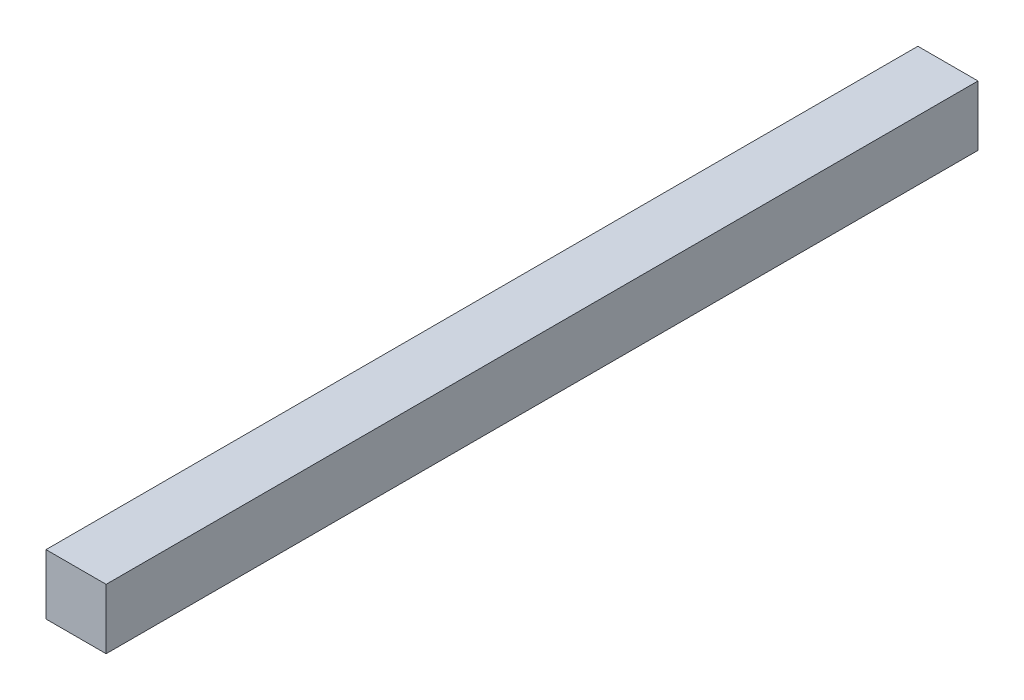
ISO-10303-21;
HEADER;
FILE_DESCRIPTION(('STEP AP214'),'2;1');
FILE_NAME('part.step','',(''),(''),'','','');
FILE_SCHEMA(('AUTOMOTIVE_DESIGN { 1 0 10303 214 1 1 1 1 }'));
ENDSEC;
DATA;
#1=APPLICATION_CONTEXT('core data for automotive mechanical design processes');
#2=APPLICATION_PROTOCOL_DEFINITION('international standard','automotive_design',2000,#1);
#3=PRODUCT_CONTEXT('',#1,'mechanical');
#4=PRODUCT('Part','Part','',(#3));
#5=PRODUCT_RELATED_PRODUCT_CATEGORY('part','',(#4));
#6=PRODUCT_DEFINITION_FORMATION('','',#4);
#7=PRODUCT_DEFINITION_CONTEXT('part definition',#1,'design');
#8=PRODUCT_DEFINITION('design','',#6,#7);
#9=PRODUCT_DEFINITION_SHAPE('','',#8);
#10=(LENGTH_UNIT() NAMED_UNIT(*) SI_UNIT(.MILLI.,.METRE.));
#11=(NAMED_UNIT(*) PLANE_ANGLE_UNIT() SI_UNIT($,.RADIAN.));
#12=(NAMED_UNIT(*) SI_UNIT($,.STERADIAN.) SOLID_ANGLE_UNIT());
#13=UNCERTAINTY_MEASURE_WITH_UNIT(LENGTH_MEASURE(1.E-05),#10,'distance_accuracy_value','');
#14=(GEOMETRIC_REPRESENTATION_CONTEXT(3) GLOBAL_UNCERTAINTY_ASSIGNED_CONTEXT((#13)) GLOBAL_UNIT_ASSIGNED_CONTEXT((#10,
#11,#12)) REPRESENTATION_CONTEXT('',''));
#15=CARTESIAN_POINT('',(0.,0.,0.));
#16=DIRECTION('',(0.,0.,1.));
#17=DIRECTION('',(1.,0.,0.));
#18=AXIS2_PLACEMENT_3D('',#15,#16,#17);
#19=CARTESIAN_POINT('',(-3.,6.,43.5));
#20=DIRECTION('',(1.,0.,0.));
#21=DIRECTION('',(0.,0.,-1.));
#22=AXIS2_PLACEMENT_3D('',#19,#20,#21);
#23=PLANE('',#22);
#24=DIRECTION('',(0.,0.,1.));
#25=VECTOR('',#24,1.);
#26=CARTESIAN_POINT('',(-3.,0.,43.5));
#27=LINE('',#26,#25);
#28=CARTESIAN_POINT('',(-3.,0.,-43.5));
#29=VERTEX_POINT('',#28);
#30=CARTESIAN_POINT('',(-3.,0.,43.5));
#31=VERTEX_POINT('',#30);
#32=EDGE_CURVE('E96',#29,#31,#27,.T.);
#33=ORIENTED_EDGE('',*,*,#32,.T.);
#34=DIRECTION('',(0.,-1.,0.));
#35=VECTOR('',#34,1.);
#36=CARTESIAN_POINT('',(-3.,6.,43.5));
#37=LINE('',#36,#35);
#38=CARTESIAN_POINT('',(-3.,6.,43.5));
#39=VERTEX_POINT('',#38);
#40=EDGE_CURVE('E11',#39,#31,#37,.T.);
#41=ORIENTED_EDGE('',*,*,#40,.F.);
#42=DIRECTION('',(0.,0.,1.));
#43=VECTOR('',#42,1.);
#44=CARTESIAN_POINT('',(-3.,6.,43.5));
#45=LINE('',#44,#43);
#46=CARTESIAN_POINT('',(-3.,6.,-43.5));
#47=VERTEX_POINT('',#46);
#48=EDGE_CURVE('E84',#47,#39,#45,.T.);
#49=ORIENTED_EDGE('',*,*,#48,.F.);
#50=DIRECTION('',(0.,-1.,0.));
#51=VECTOR('',#50,1.);
#52=CARTESIAN_POINT('',(-3.,6.,-43.5));
#53=LINE('',#52,#51);
#54=EDGE_CURVE('E92',#47,#29,#53,.T.);
#55=ORIENTED_EDGE('',*,*,#54,.T.);
#56=EDGE_LOOP('',(#33,#41,#49,#55));
#57=FACE_BOUND('',#56,.T.);
#58=ADVANCED_FACE('F33',(#57),#23,.F.);
#59=CARTESIAN_POINT('',(3.,6.,43.5));
#60=DIRECTION('',(0.,0.,-1.));
#61=DIRECTION('',(-1.,0.,0.));
#62=AXIS2_PLACEMENT_3D('',#59,#60,#61);
#63=PLANE('',#62);
#64=DIRECTION('',(1.,0.,0.));
#65=VECTOR('',#64,1.);
#66=CARTESIAN_POINT('',(3.,0.,43.5));
#67=LINE('',#66,#65);
#68=CARTESIAN_POINT('',(3.,0.,43.5));
#69=VERTEX_POINT('',#68);
#70=EDGE_CURVE('E88',#31,#69,#67,.T.);
#71=ORIENTED_EDGE('',*,*,#70,.T.);
#72=DIRECTION('',(0.,-1.,0.));
#73=VECTOR('',#72,1.);
#74=CARTESIAN_POINT('',(3.,6.,43.5));
#75=LINE('',#74,#73);
#76=CARTESIAN_POINT('',(3.,6.,43.5));
#77=VERTEX_POINT('',#76);
#78=EDGE_CURVE('E41',#77,#69,#75,.T.);
#79=ORIENTED_EDGE('',*,*,#78,.F.);
#80=DIRECTION('',(1.,0.,0.));
#81=VECTOR('',#80,1.);
#82=CARTESIAN_POINT('',(3.,6.,43.5));
#83=LINE('',#82,#81);
#84=EDGE_CURVE('E79',#39,#77,#83,.T.);
#85=ORIENTED_EDGE('',*,*,#84,.F.);
#86=ORIENTED_EDGE('',*,*,#40,.T.);
#87=EDGE_LOOP('',(#71,#79,#85,#86));
#88=FACE_BOUND('',#87,.T.);
#89=ADVANCED_FACE('F87',(#88),#63,.F.);
#90=CARTESIAN_POINT('',(3.,6.,43.5));
#91=DIRECTION('',(-1.,0.,0.));
#92=DIRECTION('',(0.,0.,1.));
#93=AXIS2_PLACEMENT_3D('',#90,#91,#92);
#94=PLANE('',#93);
#95=DIRECTION('',(0.,0.,-1.));
#96=VECTOR('',#95,1.);
#97=CARTESIAN_POINT('',(3.,0.,43.5));
#98=LINE('',#97,#96);
#99=CARTESIAN_POINT('',(3.,0.,-43.5));
#100=VERTEX_POINT('',#99);
#101=EDGE_CURVE('E66',#69,#100,#98,.T.);
#102=ORIENTED_EDGE('',*,*,#101,.T.);
#103=DIRECTION('',(0.,-1.,0.));
#104=VECTOR('',#103,1.);
#105=CARTESIAN_POINT('',(3.,6.,-43.5));
#106=LINE('',#105,#104);
#107=CARTESIAN_POINT('',(3.,6.,-43.5));
#108=VERTEX_POINT('',#107);
#109=EDGE_CURVE('E89',#108,#100,#106,.T.);
#110=ORIENTED_EDGE('',*,*,#109,.F.);
#111=DIRECTION('',(0.,0.,-1.));
#112=VECTOR('',#111,1.);
#113=CARTESIAN_POINT('',(3.,6.,43.5));
#114=LINE('',#113,#112);
#115=EDGE_CURVE('E82',#77,#108,#114,.T.);
#116=ORIENTED_EDGE('',*,*,#115,.F.);
#117=ORIENTED_EDGE('',*,*,#78,.T.);
#118=EDGE_LOOP('',(#102,#110,#116,#117));
#119=FACE_BOUND('',#118,.T.);
#120=ADVANCED_FACE('F90',(#119),#94,.F.);
#121=CARTESIAN_POINT('',(3.,6.,-43.5));
#122=DIRECTION('',(0.,0.,1.));
#123=DIRECTION('',(1.,0.,0.));
#124=AXIS2_PLACEMENT_3D('',#121,#122,#123);
#125=PLANE('',#124);
#126=DIRECTION('',(-1.,0.,0.));
#127=VECTOR('',#126,1.);
#128=CARTESIAN_POINT('',(3.,0.,-43.5));
#129=LINE('',#128,#127);
#130=EDGE_CURVE('E72',#100,#29,#129,.T.);
#131=ORIENTED_EDGE('',*,*,#130,.T.);
#132=ORIENTED_EDGE('',*,*,#54,.F.);
#133=DIRECTION('',(-1.,0.,0.));
#134=VECTOR('',#133,1.);
#135=CARTESIAN_POINT('',(3.,6.,-43.5));
#136=LINE('',#135,#134);
#137=EDGE_CURVE('E49',#108,#47,#136,.T.);
#138=ORIENTED_EDGE('',*,*,#137,.F.);
#139=ORIENTED_EDGE('',*,*,#109,.T.);
#140=EDGE_LOOP('',(#131,#132,#138,#139));
#141=FACE_BOUND('',#140,.T.);
#142=ADVANCED_FACE('F103',(#141),#125,.F.);
#143=CARTESIAN_POINT('',(0.,6.,0.));
#144=DIRECTION('',(0.,1.,0.));
#145=DIRECTION('',(0.,0.,1.));
#146=AXIS2_PLACEMENT_3D('',#143,#144,#145);
#147=PLANE('',#146);
#148=ORIENTED_EDGE('',*,*,#48,.T.);
#149=ORIENTED_EDGE('',*,*,#84,.T.);
#150=ORIENTED_EDGE('',*,*,#115,.T.);
#151=ORIENTED_EDGE('',*,*,#137,.T.);
#152=EDGE_LOOP('',(#148,#149,#150,#151));
#153=FACE_BOUND('',#152,.T.);
#154=ADVANCED_FACE('F80',(#153),#147,.T.);
#155=CARTESIAN_POINT('',(0.,0.,0.));
#156=DIRECTION('',(0.,1.,0.));
#157=DIRECTION('',(0.,0.,1.));
#158=AXIS2_PLACEMENT_3D('',#155,#156,#157);
#159=PLANE('',#158);
#160=ORIENTED_EDGE('',*,*,#32,.F.);
#161=ORIENTED_EDGE('',*,*,#130,.F.);
#162=ORIENTED_EDGE('',*,*,#101,.F.);
#163=ORIENTED_EDGE('',*,*,#70,.F.);
#164=EDGE_LOOP('',(#160,#161,#162,#163));
#165=FACE_BOUND('',#164,.T.);
#166=ADVANCED_FACE('F106',(#165),#159,.F.);
#167=CLOSED_SHELL('',(#58,#89,#120,#142,#154,#166));
#168=MANIFOLD_SOLID_BREP('B2',#167);
#169=ADVANCED_BREP_SHAPE_REPRESENTATION('',(#18,#168),#14);
#170=SHAPE_DEFINITION_REPRESENTATION(#9,#169);
ENDSEC;
END-ISO-10303-21;
